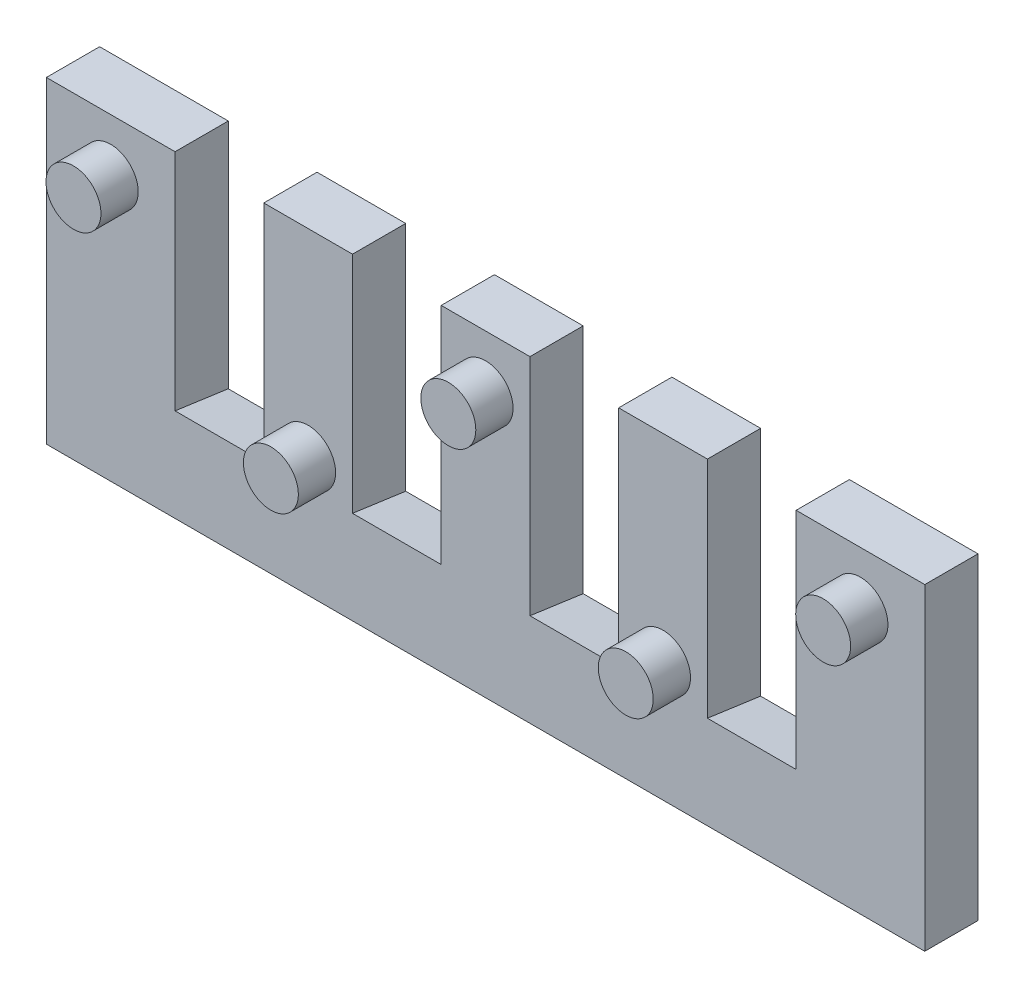
ISO-10303-21;
HEADER;
FILE_DESCRIPTION(('STEP AP214'),'2;1');
FILE_NAME('part.step','',(''),(''),'','','');
FILE_SCHEMA(('AUTOMOTIVE_DESIGN { 1 0 10303 214 1 1 1 1 }'));
ENDSEC;
DATA;
#1=APPLICATION_CONTEXT('core data for automotive mechanical design processes');
#2=APPLICATION_PROTOCOL_DEFINITION('international standard','automotive_design',2000,#1);
#3=PRODUCT_CONTEXT('',#1,'mechanical');
#4=PRODUCT('Part','Part','',(#3));
#5=PRODUCT_RELATED_PRODUCT_CATEGORY('part','',(#4));
#6=PRODUCT_DEFINITION_FORMATION('','',#4);
#7=PRODUCT_DEFINITION_CONTEXT('part definition',#1,'design');
#8=PRODUCT_DEFINITION('design','',#6,#7);
#9=PRODUCT_DEFINITION_SHAPE('','',#8);
#10=(LENGTH_UNIT() NAMED_UNIT(*) SI_UNIT(.MILLI.,.METRE.));
#11=(NAMED_UNIT(*) PLANE_ANGLE_UNIT() SI_UNIT($,.RADIAN.));
#12=(NAMED_UNIT(*) SI_UNIT($,.STERADIAN.) SOLID_ANGLE_UNIT());
#13=UNCERTAINTY_MEASURE_WITH_UNIT(LENGTH_MEASURE(1.E-05),#10,'distance_accuracy_value','');
#14=(GEOMETRIC_REPRESENTATION_CONTEXT(3) GLOBAL_UNCERTAINTY_ASSIGNED_CONTEXT((#13)) GLOBAL_UNIT_ASSIGNED_CONTEXT((#10,
#11,#12)) REPRESENTATION_CONTEXT('',''));
#15=CARTESIAN_POINT('',(0.,0.,0.));
#16=DIRECTION('',(0.,0.,1.));
#17=DIRECTION('',(1.,0.,0.));
#18=AXIS2_PLACEMENT_3D('',#15,#16,#17);
#19=CARTESIAN_POINT('',(0.,0.,0.));
#20=DIRECTION('',(0.,0.99026806874157,-0.139173100960066));
#21=DIRECTION('',(0.,0.139173100960066,0.99026806874157));
#22=AXIS2_PLACEMENT_3D('',#19,#20,#21);
#23=PLANE('',#22);
#24=DIRECTION('',(-1.,0.,0.));
#25=VECTOR('',#24,1.);
#26=CARTESIAN_POINT('',(0.,-16.864900164287,-120.));
#27=LINE('',#26,#25);
#28=CARTESIAN_POINT('',(23.3333333333333,-16.864900164287,-120.));
#29=VERTEX_POINT('',#28);
#30=CARTESIAN_POINT('',(16.6666666666667,-16.864900164287,-120.));
#31=VERTEX_POINT('',#30);
#32=EDGE_CURVE('E301',#29,#31,#27,.T.);
#33=ORIENTED_EDGE('',*,*,#32,.F.);
#34=DIRECTION('',(0.,0.139173100960066,0.99026806874157));
#35=VECTOR('',#34,1.);
#36=CARTESIAN_POINT('',(23.3333333333333,0.,0.));
#37=LINE('',#36,#35);
#38=CARTESIAN_POINT('',(23.3333333333333,-17.4270635030966,-124.));
#39=VERTEX_POINT('',#38);
#40=EDGE_CURVE('E244',#39,#29,#37,.T.);
#41=ORIENTED_EDGE('',*,*,#40,.F.);
#42=DIRECTION('',(1.,0.,0.));
#43=VECTOR('',#42,1.);
#44=CARTESIAN_POINT('',(33.,-17.4270635030966,-124.));
#45=LINE('',#44,#43);
#46=CARTESIAN_POINT('',(16.6666666666667,-17.4270635030966,-124.));
#47=VERTEX_POINT('',#46);
#48=EDGE_CURVE('E263',#47,#39,#45,.T.);
#49=ORIENTED_EDGE('',*,*,#48,.F.);
#50=DIRECTION('',(0.,-0.139173100960066,-0.99026806874157));
#51=VECTOR('',#50,1.);
#52=CARTESIAN_POINT('',(16.6666666666667,-17.5517589401369,-124.887254137236));
#53=LINE('',#52,#51);
#54=EDGE_CURVE('E242',#31,#47,#53,.T.);
#55=ORIENTED_EDGE('',*,*,#54,.F.);
#56=EDGE_LOOP('',(#33,#41,#49,#55));
#57=FACE_BOUND('',#56,.T.);
#58=ADVANCED_FACE('F39',(#57),#23,.T.);
#59=CARTESIAN_POINT('',(16.6666666666667,19.1503740799003,-130.04540254723));
#60=DIRECTION('',(-1.,0.,0.));
#61=DIRECTION('',(0.,0.,1.));
#62=AXIS2_PLACEMENT_3D('',#59,#60,#61);
#63=PLANE('',#62);
#64=DIRECTION('',(0.,0.,1.));
#65=VECTOR('',#64,1.);
#66=CARTESIAN_POINT('',(16.6666666666667,0.,0.));
#67=LINE('',#66,#65);
#68=CARTESIAN_POINT('',(16.6666666666667,0.,-124.));
#69=VERTEX_POINT('',#68);
#70=CARTESIAN_POINT('',(16.6666666666667,0.,-120.));
#71=VERTEX_POINT('',#70);
#72=EDGE_CURVE('E266',#69,#71,#67,.T.);
#73=ORIENTED_EDGE('',*,*,#72,.T.);
#74=DIRECTION('',(0.,-1.,0.));
#75=VECTOR('',#74,1.);
#76=CARTESIAN_POINT('',(16.6666666666667,19.1503740799003,-120.));
#77=LINE('',#76,#75);
#78=EDGE_CURVE('E320',#71,#31,#77,.T.);
#79=ORIENTED_EDGE('',*,*,#78,.T.);
#80=ORIENTED_EDGE('',*,*,#54,.T.);
#81=DIRECTION('',(0.,1.,0.));
#82=VECTOR('',#81,1.);
#83=CARTESIAN_POINT('',(16.6666666666667,0.,-124.));
#84=LINE('',#83,#82);
#85=EDGE_CURVE('E269',#47,#69,#84,.T.);
#86=ORIENTED_EDGE('',*,*,#85,.T.);
#87=EDGE_LOOP('',(#73,#79,#80,#86));
#88=FACE_BOUND('',#87,.T.);
#89=ADVANCED_FACE('F396',(#88),#63,.F.);
#90=CARTESIAN_POINT('',(33.,0.,0.));
#91=DIRECTION('',(0.,1.,0.));
#92=DIRECTION('',(0.,0.,1.));
#93=AXIS2_PLACEMENT_3D('',#90,#91,#92);
#94=PLANE('',#93);
#95=DIRECTION('',(-1.,0.,0.));
#96=VECTOR('',#95,1.);
#97=CARTESIAN_POINT('',(33.,0.,-120.));
#98=LINE('',#97,#96);
#99=CARTESIAN_POINT('',(10.,0.,-120.));
#100=VERTEX_POINT('',#99);
#101=EDGE_CURVE('E306',#71,#100,#98,.T.);
#102=ORIENTED_EDGE('',*,*,#101,.F.);
#103=ORIENTED_EDGE('',*,*,#72,.F.);
#104=DIRECTION('',(-1.,0.,0.));
#105=VECTOR('',#104,1.);
#106=CARTESIAN_POINT('',(33.,0.,-124.));
#107=LINE('',#106,#105);
#108=CARTESIAN_POINT('',(10.,0.,-124.));
#109=VERTEX_POINT('',#108);
#110=EDGE_CURVE('E290',#69,#109,#107,.T.);
#111=ORIENTED_EDGE('',*,*,#110,.T.);
#112=DIRECTION('',(0.,0.,-1.));
#113=VECTOR('',#112,1.);
#114=CARTESIAN_POINT('',(10.,0.,0.));
#115=LINE('',#114,#113);
#116=EDGE_CURVE('E259',#100,#109,#115,.T.);
#117=ORIENTED_EDGE('',*,*,#116,.F.);
#118=EDGE_LOOP('',(#102,#103,#111,#117));
#119=FACE_BOUND('',#118,.T.);
#120=ADVANCED_FACE('F400',(#119),#94,.T.);
#121=CARTESIAN_POINT('',(10.,36.7021330200372,-5.15814840999424));
#122=DIRECTION('',(1.,0.,0.));
#123=DIRECTION('',(0.,0.,-1.));
#124=AXIS2_PLACEMENT_3D('',#121,#122,#123);
#125=PLANE('',#124);
#126=DIRECTION('',(0.,0.139173100960066,0.99026806874157));
#127=VECTOR('',#126,1.);
#128=CARTESIAN_POINT('',(10.,0.,0.));
#129=LINE('',#128,#127);
#130=CARTESIAN_POINT('',(10.,-17.4270635030966,-124.));
#131=VERTEX_POINT('',#130);
#132=CARTESIAN_POINT('',(10.,-16.864900164287,-120.));
#133=VERTEX_POINT('',#132);
#134=EDGE_CURVE('E245',#131,#133,#129,.T.);
#135=ORIENTED_EDGE('',*,*,#134,.T.);
#136=DIRECTION('',(0.,1.,0.));
#137=VECTOR('',#136,1.);
#138=CARTESIAN_POINT('',(10.,36.7021330200373,-120.));
#139=LINE('',#138,#137);
#140=EDGE_CURVE('E312',#133,#100,#139,.T.);
#141=ORIENTED_EDGE('',*,*,#140,.T.);
#142=ORIENTED_EDGE('',*,*,#116,.T.);
#143=DIRECTION('',(0.,-1.,0.));
#144=VECTOR('',#143,1.);
#145=CARTESIAN_POINT('',(10.,0.,-124.));
#146=LINE('',#145,#144);
#147=EDGE_CURVE('E261',#109,#131,#146,.T.);
#148=ORIENTED_EDGE('',*,*,#147,.T.);
#149=EDGE_LOOP('',(#135,#141,#142,#148));
#150=FACE_BOUND('',#149,.T.);
#151=ADVANCED_FACE('F416',(#150),#125,.F.);
#152=CARTESIAN_POINT('',(0.,0.,0.));
#153=DIRECTION('',(0.,0.99026806874157,-0.139173100960066));
#154=DIRECTION('',(0.,0.139173100960066,0.99026806874157));
#155=AXIS2_PLACEMENT_3D('',#152,#153,#154);
#156=PLANE('',#155);
#157=DIRECTION('',(-1.,0.,0.));
#158=VECTOR('',#157,1.);
#159=CARTESIAN_POINT('',(0.,-16.864900164287,-120.));
#160=LINE('',#159,#158);
#161=CARTESIAN_POINT('',(3.33333333333333,-16.864900164287,-120.));
#162=VERTEX_POINT('',#161);
#163=EDGE_CURVE('E305',#133,#162,#160,.T.);
#164=ORIENTED_EDGE('',*,*,#163,.F.);
#165=ORIENTED_EDGE('',*,*,#134,.F.);
#166=DIRECTION('',(1.,0.,0.));
#167=VECTOR('',#166,1.);
#168=CARTESIAN_POINT('',(33.,-17.4270635030966,-124.));
#169=LINE('',#168,#167);
#170=CARTESIAN_POINT('',(3.33333333333333,-17.4270635030966,-124.));
#171=VERTEX_POINT('',#170);
#172=EDGE_CURVE('E248',#171,#131,#169,.T.);
#173=ORIENTED_EDGE('',*,*,#172,.F.);
#174=DIRECTION('',(0.,-0.139173100960066,-0.99026806874157));
#175=VECTOR('',#174,1.);
#176=CARTESIAN_POINT('',(3.33333333333333,-17.5517589401369,-124.887254137236));
#177=LINE('',#176,#175);
#178=EDGE_CURVE('E241',#162,#171,#177,.T.);
#179=ORIENTED_EDGE('',*,*,#178,.F.);
#180=EDGE_LOOP('',(#164,#165,#173,#179));
#181=FACE_BOUND('',#180,.T.);
#182=ADVANCED_FACE('F414',(#181),#156,.T.);
#183=CARTESIAN_POINT('',(3.33333333333333,19.1503740799003,-130.04540254723));
#184=DIRECTION('',(-1.,0.,0.));
#185=DIRECTION('',(0.,0.,1.));
#186=AXIS2_PLACEMENT_3D('',#183,#184,#185);
#187=PLANE('',#186);
#188=DIRECTION('',(0.,0.,1.));
#189=VECTOR('',#188,1.);
#190=CARTESIAN_POINT('',(3.33333333333332,0.,0.));
#191=LINE('',#190,#189);
#192=CARTESIAN_POINT('',(3.33333333333333,0.,-124.));
#193=VERTEX_POINT('',#192);
#194=CARTESIAN_POINT('',(3.33333333333333,0.,-120.));
#195=VERTEX_POINT('',#194);
#196=EDGE_CURVE('E254',#193,#195,#191,.T.);
#197=ORIENTED_EDGE('',*,*,#196,.T.);
#198=DIRECTION('',(0.,-1.,0.));
#199=VECTOR('',#198,1.);
#200=CARTESIAN_POINT('',(3.33333333333333,19.1503740799003,-120.));
#201=LINE('',#200,#199);
#202=EDGE_CURVE('E326',#195,#162,#201,.T.);
#203=ORIENTED_EDGE('',*,*,#202,.T.);
#204=ORIENTED_EDGE('',*,*,#178,.T.);
#205=DIRECTION('',(0.,1.,0.));
#206=VECTOR('',#205,1.);
#207=CARTESIAN_POINT('',(3.33333333333333,0.,-124.));
#208=LINE('',#207,#206);
#209=EDGE_CURVE('E257',#171,#193,#208,.T.);
#210=ORIENTED_EDGE('',*,*,#209,.T.);
#211=EDGE_LOOP('',(#197,#203,#204,#210));
#212=FACE_BOUND('',#211,.T.);
#213=ADVANCED_FACE('F408',(#212),#187,.F.);
#214=DIRECTION('',(-1.,0.,0.));
#215=VECTOR('',#214,1.);
#216=CARTESIAN_POINT('',(33.,0.,-120.));
#217=LINE('',#216,#215);
#218=CARTESIAN_POINT('',(33.,0.,-120.));
#219=VERTEX_POINT('',#218);
#220=CARTESIAN_POINT('',(23.3333333333333,0.,-120.));
#221=VERTEX_POINT('',#220);
#222=EDGE_CURVE('E309',#219,#221,#217,.T.);
#223=ORIENTED_EDGE('',*,*,#222,.F.);
#224=DIRECTION('',(0.,0.,-1.));
#225=VECTOR('',#224,1.);
#226=CARTESIAN_POINT('',(33.,0.,0.));
#227=LINE('',#226,#225);
#228=CARTESIAN_POINT('',(33.,0.,-124.));
#229=VERTEX_POINT('',#228);
#230=EDGE_CURVE('E283',#219,#229,#227,.T.);
#231=ORIENTED_EDGE('',*,*,#230,.T.);
#232=CARTESIAN_POINT('',(23.3333333333333,0.,-124.));
#233=VERTEX_POINT('',#232);
#234=EDGE_CURVE('E286',#229,#233,#107,.T.);
#235=ORIENTED_EDGE('',*,*,#234,.T.);
#236=DIRECTION('',(0.,0.,-1.));
#237=VECTOR('',#236,1.);
#238=CARTESIAN_POINT('',(23.3333333333333,0.,0.));
#239=LINE('',#238,#237);
#240=EDGE_CURVE('E271',#221,#233,#239,.T.);
#241=ORIENTED_EDGE('',*,*,#240,.F.);
#242=EDGE_LOOP('',(#223,#231,#235,#241));
#243=FACE_BOUND('',#242,.T.);
#244=ADVANCED_FACE('F380',(#243),#94,.T.);
#245=CARTESIAN_POINT('',(23.3333333333333,36.7021330200372,-5.15814840999424));
#246=DIRECTION('',(1.,0.,0.));
#247=DIRECTION('',(0.,0.,-1.));
#248=AXIS2_PLACEMENT_3D('',#245,#246,#247);
#249=PLANE('',#248);
#250=ORIENTED_EDGE('',*,*,#40,.T.);
#251=DIRECTION('',(0.,1.,0.));
#252=VECTOR('',#251,1.);
#253=CARTESIAN_POINT('',(23.3333333333333,36.7021330200373,-120.));
#254=LINE('',#253,#252);
#255=EDGE_CURVE('E324',#29,#221,#254,.T.);
#256=ORIENTED_EDGE('',*,*,#255,.T.);
#257=ORIENTED_EDGE('',*,*,#240,.T.);
#258=DIRECTION('',(0.,-1.,0.));
#259=VECTOR('',#258,1.);
#260=CARTESIAN_POINT('',(23.3333333333333,0.,-124.));
#261=LINE('',#260,#259);
#262=EDGE_CURVE('E273',#233,#39,#261,.T.);
#263=ORIENTED_EDGE('',*,*,#262,.T.);
#264=EDGE_LOOP('',(#250,#256,#257,#263));
#265=FACE_BOUND('',#264,.T.);
#266=ADVANCED_FACE('F389',(#265),#249,.F.);
#267=DIRECTION('',(-1.,0.,0.));
#268=VECTOR('',#267,1.);
#269=CARTESIAN_POINT('',(33.,0.,-120.));
#270=LINE('',#269,#268);
#271=CARTESIAN_POINT('',(-3.33333333333333,0.,-120.));
#272=VERTEX_POINT('',#271);
#273=EDGE_CURVE('E302',#195,#272,#270,.T.);
#274=ORIENTED_EDGE('',*,*,#273,.F.);
#275=ORIENTED_EDGE('',*,*,#196,.F.);
#276=CARTESIAN_POINT('',(-3.33333333333333,0.,-124.));
#277=VERTEX_POINT('',#276);
#278=EDGE_CURVE('E285',#193,#277,#107,.T.);
#279=ORIENTED_EDGE('',*,*,#278,.T.);
#280=DIRECTION('',(0.,0.,1.));
#281=VECTOR('',#280,1.);
#282=CARTESIAN_POINT('',(-3.33333333333332,0.,0.));
#283=LINE('',#282,#281);
#284=EDGE_CURVE('E195',#277,#272,#283,.T.);
#285=ORIENTED_EDGE('',*,*,#284,.T.);
#286=EDGE_LOOP('',(#274,#275,#279,#285));
#287=FACE_BOUND('',#286,.T.);
#288=ADVANCED_FACE('F404',(#287),#94,.T.);
#289=CARTESIAN_POINT('',(-10.,36.7021330200372,-5.15814840999424));
#290=DIRECTION('',(-1.,0.,0.));
#291=DIRECTION('',(0.,0.,-1.));
#292=AXIS2_PLACEMENT_3D('',#289,#290,#291);
#293=PLANE('',#292);
#294=DIRECTION('',(0.,0.,-1.));
#295=VECTOR('',#294,1.);
#296=CARTESIAN_POINT('',(-10.,0.,0.));
#297=LINE('',#296,#295);
#298=CARTESIAN_POINT('',(-10.,0.,-120.));
#299=VERTEX_POINT('',#298);
#300=CARTESIAN_POINT('',(-10.,0.,-124.));
#301=VERTEX_POINT('',#300);
#302=EDGE_CURVE('E198',#299,#301,#297,.T.);
#303=ORIENTED_EDGE('',*,*,#302,.F.);
#304=DIRECTION('',(0.,-1.,0.));
#305=VECTOR('',#304,1.);
#306=CARTESIAN_POINT('',(-10.,36.7021330200373,-120.));
#307=LINE('',#306,#305);
#308=CARTESIAN_POINT('',(-10.,-16.864900164287,-120.));
#309=VERTEX_POINT('',#308);
#310=EDGE_CURVE('E318',#299,#309,#307,.T.);
#311=ORIENTED_EDGE('',*,*,#310,.T.);
#312=DIRECTION('',(0.,0.139173100960066,0.99026806874157));
#313=VECTOR('',#312,1.);
#314=CARTESIAN_POINT('',(-10.,0.,0.));
#315=LINE('',#314,#313);
#316=CARTESIAN_POINT('',(-10.,-17.4270635030966,-124.));
#317=VERTEX_POINT('',#316);
#318=EDGE_CURVE('E187',#317,#309,#315,.T.);
#319=ORIENTED_EDGE('',*,*,#318,.F.);
#320=DIRECTION('',(0.,-1.,0.));
#321=VECTOR('',#320,1.);
#322=CARTESIAN_POINT('',(-10.,0.,-124.));
#323=LINE('',#322,#321);
#324=EDGE_CURVE('E204',#301,#317,#323,.T.);
#325=ORIENTED_EDGE('',*,*,#324,.F.);
#326=EDGE_LOOP('',(#303,#311,#319,#325));
#327=FACE_BOUND('',#326,.T.);
#328=ADVANCED_FACE('F437',(#327),#293,.F.);
#329=CARTESIAN_POINT('',(-33.,0.,0.));
#330=DIRECTION('',(0.,1.,0.));
#331=DIRECTION('',(0.,0.,1.));
#332=AXIS2_PLACEMENT_3D('',#329,#330,#331);
#333=PLANE('',#332);
#334=DIRECTION('',(-1.,0.,0.));
#335=VECTOR('',#334,1.);
#336=CARTESIAN_POINT('',(-33.,0.,-120.));
#337=LINE('',#336,#335);
#338=CARTESIAN_POINT('',(-23.3333333333333,0.,-120.));
#339=VERTEX_POINT('',#338);
#340=CARTESIAN_POINT('',(-33.,0.,-120.));
#341=VERTEX_POINT('',#340);
#342=EDGE_CURVE('E298',#339,#341,#337,.T.);
#343=ORIENTED_EDGE('',*,*,#342,.F.);
#344=DIRECTION('',(0.,0.,-1.));
#345=VECTOR('',#344,1.);
#346=CARTESIAN_POINT('',(-23.3333333333333,0.,0.));
#347=LINE('',#346,#345);
#348=CARTESIAN_POINT('',(-23.3333333333333,0.,-124.));
#349=VERTEX_POINT('',#348);
#350=EDGE_CURVE('E222',#339,#349,#347,.T.);
#351=ORIENTED_EDGE('',*,*,#350,.T.);
#352=DIRECTION('',(1.,0.,0.));
#353=VECTOR('',#352,1.);
#354=CARTESIAN_POINT('',(-33.,0.,-124.));
#355=LINE('',#354,#353);
#356=CARTESIAN_POINT('',(-33.,0.,-124.));
#357=VERTEX_POINT('',#356);
#358=EDGE_CURVE('E238',#357,#349,#355,.T.);
#359=ORIENTED_EDGE('',*,*,#358,.F.);
#360=DIRECTION('',(0.,0.,-1.));
#361=VECTOR('',#360,1.);
#362=CARTESIAN_POINT('',(-33.,0.,0.));
#363=LINE('',#362,#361);
#364=EDGE_CURVE('E235',#341,#357,#363,.T.);
#365=ORIENTED_EDGE('',*,*,#364,.F.);
#366=EDGE_LOOP('',(#343,#351,#359,#365));
#367=FACE_BOUND('',#366,.T.);
#368=ADVANCED_FACE('F433',(#367),#333,.T.);
#369=DIRECTION('',(-1.,0.,0.));
#370=VECTOR('',#369,1.);
#371=CARTESIAN_POINT('',(-33.,0.,-120.));
#372=LINE('',#371,#370);
#373=CARTESIAN_POINT('',(-16.6666666666667,0.,-120.));
#374=VERTEX_POINT('',#373);
#375=EDGE_CURVE('E295',#299,#374,#372,.T.);
#376=ORIENTED_EDGE('',*,*,#375,.F.);
#377=ORIENTED_EDGE('',*,*,#302,.T.);
#378=CARTESIAN_POINT('',(-16.6666666666667,0.,-124.));
#379=VERTEX_POINT('',#378);
#380=EDGE_CURVE('E237',#379,#301,#355,.T.);
#381=ORIENTED_EDGE('',*,*,#380,.F.);
#382=DIRECTION('',(0.,0.,1.));
#383=VECTOR('',#382,1.);
#384=CARTESIAN_POINT('',(-16.6666666666667,0.,0.));
#385=LINE('',#384,#383);
#386=EDGE_CURVE('E217',#379,#374,#385,.T.);
#387=ORIENTED_EDGE('',*,*,#386,.T.);
#388=EDGE_LOOP('',(#376,#377,#381,#387));
#389=FACE_BOUND('',#388,.T.);
#390=ADVANCED_FACE('F436',(#389),#333,.T.);
#391=CARTESIAN_POINT('',(-23.3333333333333,36.7021330200372,-5.15814840999424));
#392=DIRECTION('',(-1.,0.,0.));
#393=DIRECTION('',(0.,0.,-1.));
#394=AXIS2_PLACEMENT_3D('',#391,#392,#393);
#395=PLANE('',#394);
#396=ORIENTED_EDGE('',*,*,#350,.F.);
#397=DIRECTION('',(0.,-1.,0.));
#398=VECTOR('',#397,1.);
#399=CARTESIAN_POINT('',(-23.3333333333333,36.7021330200373,-120.));
#400=LINE('',#399,#398);
#401=CARTESIAN_POINT('',(-23.3333333333333,-16.864900164287,-120.));
#402=VERTEX_POINT('',#401);
#403=EDGE_CURVE('E62',#339,#402,#400,.T.);
#404=ORIENTED_EDGE('',*,*,#403,.T.);
#405=DIRECTION('',(0.,0.139173100960066,0.99026806874157));
#406=VECTOR('',#405,1.);
#407=CARTESIAN_POINT('',(-23.3333333333333,0.,0.));
#408=LINE('',#407,#406);
#409=CARTESIAN_POINT('',(-23.3333333333333,-17.4270635030966,-124.));
#410=VERTEX_POINT('',#409);
#411=EDGE_CURVE('E205',#410,#402,#408,.T.);
#412=ORIENTED_EDGE('',*,*,#411,.F.);
#413=DIRECTION('',(0.,-1.,0.));
#414=VECTOR('',#413,1.);
#415=CARTESIAN_POINT('',(-23.3333333333333,0.,-124.));
#416=LINE('',#415,#414);
#417=EDGE_CURVE('E224',#349,#410,#416,.T.);
#418=ORIENTED_EDGE('',*,*,#417,.F.);
#419=EDGE_LOOP('',(#396,#404,#412,#418));
#420=FACE_BOUND('',#419,.T.);
#421=ADVANCED_FACE('F431',(#420),#395,.F.);
#422=CARTESIAN_POINT('',(33.,0.,-124.));
#423=DIRECTION('',(0.,0.,-1.));
#424=DIRECTION('',(-1.,0.,0.));
#425=AXIS2_PLACEMENT_3D('',#422,#423,#424);
#426=PLANE('',#425);
#427=ORIENTED_EDGE('',*,*,#262,.F.);
#428=ORIENTED_EDGE('',*,*,#234,.F.);
#429=DIRECTION('',(0.,-1.,0.));
#430=VECTOR('',#429,1.);
#431=CARTESIAN_POINT('',(33.,0.,-124.));
#432=LINE('',#431,#430);
#433=CARTESIAN_POINT('',(33.,-23.864900164287,-124.));
#434=VERTEX_POINT('',#433);
#435=EDGE_CURVE('E280',#229,#434,#432,.T.);
#436=ORIENTED_EDGE('',*,*,#435,.T.);
#437=DIRECTION('',(-1.,0.,0.));
#438=VECTOR('',#437,1.);
#439=CARTESIAN_POINT('',(33.,-23.864900164287,-124.));
#440=LINE('',#439,#438);
#441=CARTESIAN_POINT('',(-33.,-23.864900164287,-124.));
#442=VERTEX_POINT('',#441);
#443=EDGE_CURVE('E289',#434,#442,#440,.T.);
#444=ORIENTED_EDGE('',*,*,#443,.T.);
#445=DIRECTION('',(0.,-1.,0.));
#446=VECTOR('',#445,1.);
#447=CARTESIAN_POINT('',(-33.,0.,-124.));
#448=LINE('',#447,#446);
#449=EDGE_CURVE('E232',#357,#442,#448,.T.);
#450=ORIENTED_EDGE('',*,*,#449,.F.);
#451=ORIENTED_EDGE('',*,*,#358,.T.);
#452=ORIENTED_EDGE('',*,*,#417,.T.);
#453=DIRECTION('',(-1.,0.,0.));
#454=VECTOR('',#453,1.);
#455=CARTESIAN_POINT('',(-33.,-17.4270635030966,-124.));
#456=LINE('',#455,#454);
#457=CARTESIAN_POINT('',(-16.6666666666667,-17.4270635030966,-124.));
#458=VERTEX_POINT('',#457);
#459=EDGE_CURVE('E214',#458,#410,#456,.T.);
#460=ORIENTED_EDGE('',*,*,#459,.F.);
#461=DIRECTION('',(0.,1.,0.));
#462=VECTOR('',#461,1.);
#463=CARTESIAN_POINT('',(-16.6666666666667,0.,-124.));
#464=LINE('',#463,#462);
#465=EDGE_CURVE('E220',#458,#379,#464,.T.);
#466=ORIENTED_EDGE('',*,*,#465,.T.);
#467=ORIENTED_EDGE('',*,*,#380,.T.);
#468=ORIENTED_EDGE('',*,*,#324,.T.);
#469=DIRECTION('',(-1.,0.,0.));
#470=VECTOR('',#469,1.);
#471=CARTESIAN_POINT('',(-33.,-17.4270635030966,-124.));
#472=LINE('',#471,#470);
#473=CARTESIAN_POINT('',(-3.33333333333333,-17.4270635030966,-124.));
#474=VERTEX_POINT('',#473);
#475=EDGE_CURVE('E182',#474,#317,#472,.T.);
#476=ORIENTED_EDGE('',*,*,#475,.F.);
#477=DIRECTION('',(0.,1.,0.));
#478=VECTOR('',#477,1.);
#479=CARTESIAN_POINT('',(-3.33333333333333,0.,-124.));
#480=LINE('',#479,#478);
#481=EDGE_CURVE('E192',#474,#277,#480,.T.);
#482=ORIENTED_EDGE('',*,*,#481,.T.);
#483=ORIENTED_EDGE('',*,*,#278,.F.);
#484=ORIENTED_EDGE('',*,*,#209,.F.);
#485=ORIENTED_EDGE('',*,*,#172,.T.);
#486=ORIENTED_EDGE('',*,*,#147,.F.);
#487=ORIENTED_EDGE('',*,*,#110,.F.);
#488=ORIENTED_EDGE('',*,*,#85,.F.);
#489=ORIENTED_EDGE('',*,*,#48,.T.);
#490=EDGE_LOOP('',(#427,#428,#436,#444,#450,#451,#452,#460,#466,#467,#468,#476,#482,#483,#484,
#485,#486,#487,#488,#489));
#491=FACE_BOUND('',#490,.T.);
#492=ADVANCED_FACE('F201',(#491),#426,.T.);
#493=CARTESIAN_POINT('',(-16.6666666666667,19.1503740799003,-130.04540254723));
#494=DIRECTION('',(1.,0.,0.));
#495=DIRECTION('',(0.,0.,1.));
#496=AXIS2_PLACEMENT_3D('',#493,#494,#495);
#497=PLANE('',#496);
#498=DIRECTION('',(0.,-0.139173100960066,-0.99026806874157));
#499=VECTOR('',#498,1.);
#500=CARTESIAN_POINT('',(-16.6666666666667,-17.5517589401369,-124.887254137236));
#501=LINE('',#500,#499);
#502=CARTESIAN_POINT('',(-16.6666666666667,-16.864900164287,-120.));
#503=VERTEX_POINT('',#502);
#504=EDGE_CURVE('E208',#503,#458,#501,.T.);
#505=ORIENTED_EDGE('',*,*,#504,.F.);
#506=DIRECTION('',(0.,1.,0.));
#507=VECTOR('',#506,1.);
#508=CARTESIAN_POINT('',(-16.6666666666667,19.1503740799003,-120.));
#509=LINE('',#508,#507);
#510=EDGE_CURVE('E293',#503,#374,#509,.T.);
#511=ORIENTED_EDGE('',*,*,#510,.T.);
#512=ORIENTED_EDGE('',*,*,#386,.F.);
#513=ORIENTED_EDGE('',*,*,#465,.F.);
#514=EDGE_LOOP('',(#505,#511,#512,#513));
#515=FACE_BOUND('',#514,.T.);
#516=ADVANCED_FACE('F427',(#515),#497,.F.);
#517=CARTESIAN_POINT('',(0.,0.,0.));
#518=DIRECTION('',(0.,0.99026806874157,-0.139173100960066));
#519=DIRECTION('',(0.,0.139173100960066,0.99026806874157));
#520=AXIS2_PLACEMENT_3D('',#517,#518,#519);
#521=PLANE('',#520);
#522=DIRECTION('',(-1.,0.,0.));
#523=VECTOR('',#522,1.);
#524=CARTESIAN_POINT('',(0.,-16.864900164287,-120.));
#525=LINE('',#524,#523);
#526=EDGE_CURVE('E12',#503,#402,#525,.T.);
#527=ORIENTED_EDGE('',*,*,#526,.F.);
#528=ORIENTED_EDGE('',*,*,#504,.T.);
#529=ORIENTED_EDGE('',*,*,#459,.T.);
#530=ORIENTED_EDGE('',*,*,#411,.T.);
#531=EDGE_LOOP('',(#527,#528,#529,#530));
#532=FACE_BOUND('',#531,.T.);
#533=ADVANCED_FACE('F423',(#532),#521,.T.);
#534=CARTESIAN_POINT('',(-3.33333333333333,19.1503740799003,-130.04540254723));
#535=DIRECTION('',(1.,0.,0.));
#536=DIRECTION('',(0.,0.,1.));
#537=AXIS2_PLACEMENT_3D('',#534,#535,#536);
#538=PLANE('',#537);
#539=DIRECTION('',(0.,-0.139173100960066,-0.99026806874157));
#540=VECTOR('',#539,1.);
#541=CARTESIAN_POINT('',(-3.33333333333333,-17.5517589401369,-124.887254137236));
#542=LINE('',#541,#540);
#543=CARTESIAN_POINT('',(-3.33333333333333,-16.864900164287,-120.));
#544=VERTEX_POINT('',#543);
#545=EDGE_CURVE('E177',#544,#474,#542,.T.);
#546=ORIENTED_EDGE('',*,*,#545,.F.);
#547=DIRECTION('',(0.,1.,0.));
#548=VECTOR('',#547,1.);
#549=CARTESIAN_POINT('',(-3.33333333333333,19.1503740799003,-120.));
#550=LINE('',#549,#548);
#551=EDGE_CURVE('E315',#544,#272,#550,.T.);
#552=ORIENTED_EDGE('',*,*,#551,.T.);
#553=ORIENTED_EDGE('',*,*,#284,.F.);
#554=ORIENTED_EDGE('',*,*,#481,.F.);
#555=EDGE_LOOP('',(#546,#552,#553,#554));
#556=FACE_BOUND('',#555,.T.);
#557=ADVANCED_FACE('F193',(#556),#538,.F.);
#558=CARTESIAN_POINT('',(0.,0.,0.));
#559=DIRECTION('',(0.,0.99026806874157,-0.139173100960066));
#560=DIRECTION('',(0.,0.139173100960066,0.99026806874157));
#561=AXIS2_PLACEMENT_3D('',#558,#559,#560);
#562=PLANE('',#561);
#563=DIRECTION('',(-1.,0.,0.));
#564=VECTOR('',#563,1.);
#565=CARTESIAN_POINT('',(0.,-16.864900164287,-120.));
#566=LINE('',#565,#564);
#567=EDGE_CURVE('E48',#544,#309,#566,.T.);
#568=ORIENTED_EDGE('',*,*,#567,.F.);
#569=ORIENTED_EDGE('',*,*,#545,.T.);
#570=ORIENTED_EDGE('',*,*,#475,.T.);
#571=ORIENTED_EDGE('',*,*,#318,.T.);
#572=EDGE_LOOP('',(#568,#569,#570,#571));
#573=FACE_BOUND('',#572,.T.);
#574=ADVANCED_FACE('F179',(#573),#562,.T.);
#575=CARTESIAN_POINT('',(33.,0.,0.));
#576=DIRECTION('',(1.,0.,0.));
#577=DIRECTION('',(0.,0.,-1.));
#578=AXIS2_PLACEMENT_3D('',#575,#576,#577);
#579=PLANE('',#578);
#580=ORIENTED_EDGE('',*,*,#230,.F.);
#581=DIRECTION('',(0.,1.,0.));
#582=VECTOR('',#581,1.);
#583=CARTESIAN_POINT('',(33.,2.37904933848248E-13,-120.));
#584=LINE('',#583,#582);
#585=CARTESIAN_POINT('',(33.,-23.864900164287,-120.));
#586=VERTEX_POINT('',#585);
#587=EDGE_CURVE('E275',#586,#219,#584,.T.);
#588=ORIENTED_EDGE('',*,*,#587,.F.);
#589=DIRECTION('',(0.,0.,1.));
#590=VECTOR('',#589,1.);
#591=CARTESIAN_POINT('',(33.,-23.864900164287,0.));
#592=LINE('',#591,#590);
#593=EDGE_CURVE('E277',#434,#586,#592,.T.);
#594=ORIENTED_EDGE('',*,*,#593,.F.);
#595=ORIENTED_EDGE('',*,*,#435,.F.);
#596=EDGE_LOOP('',(#580,#588,#594,#595));
#597=FACE_BOUND('',#596,.T.);
#598=ADVANCED_FACE('F383',(#597),#579,.T.);
#599=CARTESIAN_POINT('',(33.,-23.864900164287,0.));
#600=DIRECTION('',(0.,-1.,0.));
#601=DIRECTION('',(0.,0.,-1.));
#602=AXIS2_PLACEMENT_3D('',#599,#600,#601);
#603=PLANE('',#602);
#604=DIRECTION('',(-1.,0.,0.));
#605=VECTOR('',#604,1.);
#606=CARTESIAN_POINT('',(33.,-23.864900164287,-120.));
#607=LINE('',#606,#605);
#608=CARTESIAN_POINT('',(-33.,-23.864900164287,-120.));
#609=VERTEX_POINT('',#608);
#610=EDGE_CURVE('E292',#586,#609,#607,.T.);
#611=ORIENTED_EDGE('',*,*,#610,.T.);
#612=DIRECTION('',(0.,0.,1.));
#613=VECTOR('',#612,1.);
#614=CARTESIAN_POINT('',(-33.,-23.864900164287,0.));
#615=LINE('',#614,#613);
#616=EDGE_CURVE('E229',#442,#609,#615,.T.);
#617=ORIENTED_EDGE('',*,*,#616,.F.);
#618=ORIENTED_EDGE('',*,*,#443,.F.);
#619=ORIENTED_EDGE('',*,*,#593,.T.);
#620=EDGE_LOOP('',(#611,#617,#618,#619));
#621=FACE_BOUND('',#620,.T.);
#622=ADVANCED_FACE('F366',(#621),#603,.T.);
#623=CARTESIAN_POINT('',(33.,2.37904933848248E-13,-120.));
#624=DIRECTION('',(0.,0.,1.));
#625=DIRECTION('',(0.,-1.,0.));
#626=AXIS2_PLACEMENT_3D('',#623,#624,#625);
#627=PLANE('',#626);
#628=CARTESIAN_POINT('',(-28.1666666666667,-3.99999999999977,-120.));
#629=DIRECTION('',(0.,0.,1.));
#630=DIRECTION('',(0.,-1.,0.));
#631=AXIS2_PLACEMENT_3D('',#628,#629,#630);
#632=CIRCLE('',#631,2.065);
#633=CARTESIAN_POINT('',(-28.1666666666667,-6.06499999999977,-120.));
#634=VERTEX_POINT('',#633);
#635=EDGE_CURVE('E341',#634,#634,#632,.T.);
#636=ORIENTED_EDGE('',*,*,#635,.F.);
#637=EDGE_LOOP('',(#636));
#638=FACE_BOUND('',#637,.T.);
#639=CARTESIAN_POINT('',(-13.3333333333333,-14.864900164287,-120.));
#640=DIRECTION('',(0.,0.,1.));
#641=DIRECTION('',(0.,-1.,0.));
#642=AXIS2_PLACEMENT_3D('',#639,#640,#641);
#643=CIRCLE('',#642,2.065);
#644=CARTESIAN_POINT('',(-13.3333333333333,-16.929900164287,-120.));
#645=VERTEX_POINT('',#644);
#646=EDGE_CURVE('E340',#645,#645,#643,.T.);
#647=ORIENTED_EDGE('',*,*,#646,.F.);
#648=EDGE_LOOP('',(#647));
#649=FACE_BOUND('',#648,.T.);
#650=CARTESIAN_POINT('',(0.,-3.99999999999977,-120.));
#651=DIRECTION('',(0.,0.,1.));
#652=DIRECTION('',(0.,-1.,0.));
#653=AXIS2_PLACEMENT_3D('',#650,#651,#652);
#654=CIRCLE('',#653,2.065);
#655=CARTESIAN_POINT('',(0.,-6.06499999999977,-120.));
#656=VERTEX_POINT('',#655);
#657=EDGE_CURVE('E347',#656,#656,#654,.T.);
#658=ORIENTED_EDGE('',*,*,#657,.F.);
#659=EDGE_LOOP('',(#658));
#660=FACE_BOUND('',#659,.T.);
#661=CARTESIAN_POINT('',(13.3333333333333,-14.864900164287,-120.));
#662=DIRECTION('',(0.,0.,1.));
#663=DIRECTION('',(0.,-1.,0.));
#664=AXIS2_PLACEMENT_3D('',#661,#662,#663);
#665=CIRCLE('',#664,2.065);
#666=CARTESIAN_POINT('',(13.3333333333333,-16.929900164287,-120.));
#667=VERTEX_POINT('',#666);
#668=EDGE_CURVE('E43',#667,#667,#665,.T.);
#669=ORIENTED_EDGE('',*,*,#668,.F.);
#670=EDGE_LOOP('',(#669));
#671=FACE_BOUND('',#670,.T.);
#672=CARTESIAN_POINT('',(28.1666666666667,-3.99999999999976,-120.));
#673=DIRECTION('',(0.,0.,1.));
#674=DIRECTION('',(0.,-1.,0.));
#675=AXIS2_PLACEMENT_3D('',#672,#673,#674);
#676=CIRCLE('',#675,2.065);
#677=CARTESIAN_POINT('',(28.1666666666667,-6.06499999999977,-120.));
#678=VERTEX_POINT('',#677);
#679=EDGE_CURVE('E333',#678,#678,#676,.T.);
#680=ORIENTED_EDGE('',*,*,#679,.F.);
#681=EDGE_LOOP('',(#680));
#682=FACE_BOUND('',#681,.T.);
#683=ORIENTED_EDGE('',*,*,#587,.T.);
#684=ORIENTED_EDGE('',*,*,#222,.T.);
#685=ORIENTED_EDGE('',*,*,#255,.F.);
#686=ORIENTED_EDGE('',*,*,#32,.T.);
#687=ORIENTED_EDGE('',*,*,#78,.F.);
#688=ORIENTED_EDGE('',*,*,#101,.T.);
#689=ORIENTED_EDGE('',*,*,#140,.F.);
#690=ORIENTED_EDGE('',*,*,#163,.T.);
#691=ORIENTED_EDGE('',*,*,#202,.F.);
#692=ORIENTED_EDGE('',*,*,#273,.T.);
#693=ORIENTED_EDGE('',*,*,#551,.F.);
#694=ORIENTED_EDGE('',*,*,#567,.T.);
#695=ORIENTED_EDGE('',*,*,#310,.F.);
#696=ORIENTED_EDGE('',*,*,#375,.T.);
#697=ORIENTED_EDGE('',*,*,#510,.F.);
#698=ORIENTED_EDGE('',*,*,#526,.T.);
#699=ORIENTED_EDGE('',*,*,#403,.F.);
#700=ORIENTED_EDGE('',*,*,#342,.T.);
#701=DIRECTION('',(0.,1.,0.));
#702=VECTOR('',#701,1.);
#703=CARTESIAN_POINT('',(-33.,2.37904933848248E-13,-120.));
#704=LINE('',#703,#702);
#705=EDGE_CURVE('E227',#609,#341,#704,.T.);
#706=ORIENTED_EDGE('',*,*,#705,.F.);
#707=ORIENTED_EDGE('',*,*,#610,.F.);
#708=EDGE_LOOP('',(#683,#684,#685,#686,#687,#688,#689,#690,#691,#692,#693,#694,#695,#696,#697,
#698,#699,#700,#706,#707));
#709=FACE_BOUND('',#708,.T.);
#710=ADVANCED_FACE('F362',(#638,#649,#660,#671,#682,#709),#627,.T.);
#711=CARTESIAN_POINT('',(-33.,0.,0.));
#712=DIRECTION('',(-1.,0.,0.));
#713=DIRECTION('',(0.,0.,-1.));
#714=AXIS2_PLACEMENT_3D('',#711,#712,#713);
#715=PLANE('',#714);
#716=ORIENTED_EDGE('',*,*,#705,.T.);
#717=ORIENTED_EDGE('',*,*,#364,.T.);
#718=ORIENTED_EDGE('',*,*,#449,.T.);
#719=ORIENTED_EDGE('',*,*,#616,.T.);
#720=EDGE_LOOP('',(#716,#717,#718,#719));
#721=FACE_BOUND('',#720,.T.);
#722=ADVANCED_FACE('F365',(#721),#715,.T.);
#723=CARTESIAN_POINT('',(28.1666666666667,-3.99999999999976,-117.2));
#724=DIRECTION('',(0.,0.,-1.));
#725=DIRECTION('',(-1.,0.,0.));
#726=AXIS2_PLACEMENT_3D('',#723,#724,#725);
#727=CYLINDRICAL_SURFACE('',#726,2.065);
#728=CARTESIAN_POINT('',(28.1666666666667,-3.99999999999976,-117.2));
#729=DIRECTION('',(0.,0.,1.));
#730=DIRECTION('',(1.,0.,0.));
#731=AXIS2_PLACEMENT_3D('',#728,#729,#730);
#732=CIRCLE('',#731,2.065);
#733=CARTESIAN_POINT('',(30.2316666666667,-3.99999999999976,-117.2));
#734=VERTEX_POINT('',#733);
#735=EDGE_CURVE('E188',#734,#734,#732,.T.);
#736=ORIENTED_EDGE('',*,*,#735,.F.);
#737=EDGE_LOOP('',(#736));
#738=FACE_BOUND('',#737,.T.);
#739=ORIENTED_EDGE('',*,*,#679,.T.);
#740=EDGE_LOOP('',(#739));
#741=FACE_BOUND('',#740,.T.);
#742=ADVANCED_FACE('F449',(#738,#741),#727,.T.);
#743=CARTESIAN_POINT('',(0.,0.,-117.2));
#744=DIRECTION('',(0.,0.,1.));
#745=DIRECTION('',(1.,0.,0.));
#746=AXIS2_PLACEMENT_3D('',#743,#744,#745);
#747=PLANE('',#746);
#748=ORIENTED_EDGE('',*,*,#735,.T.);
#749=EDGE_LOOP('',(#748));
#750=FACE_BOUND('',#749,.T.);
#751=ADVANCED_FACE('F455',(#750),#747,.T.);
#752=CARTESIAN_POINT('',(13.3333333333333,-14.864900164287,-117.2));
#753=DIRECTION('',(0.,0.,-1.));
#754=DIRECTION('',(-1.,0.,0.));
#755=AXIS2_PLACEMENT_3D('',#752,#753,#754);
#756=CYLINDRICAL_SURFACE('',#755,2.065);
#757=CARTESIAN_POINT('',(13.3333333333333,-14.864900164287,-117.2));
#758=DIRECTION('',(0.,0.,1.));
#759=DIRECTION('',(1.,0.,0.));
#760=AXIS2_PLACEMENT_3D('',#757,#758,#759);
#761=CIRCLE('',#760,2.065);
#762=CARTESIAN_POINT('',(15.3983333333333,-14.864900164287,-117.2));
#763=VERTEX_POINT('',#762);
#764=EDGE_CURVE('E336',#763,#763,#761,.T.);
#765=ORIENTED_EDGE('',*,*,#764,.F.);
#766=EDGE_LOOP('',(#765));
#767=FACE_BOUND('',#766,.T.);
#768=ORIENTED_EDGE('',*,*,#668,.T.);
#769=EDGE_LOOP('',(#768));
#770=FACE_BOUND('',#769,.T.);
#771=ADVANCED_FACE('F360',(#767,#770),#756,.T.);
#772=CARTESIAN_POINT('',(0.,0.,-117.2));
#773=DIRECTION('',(0.,0.,1.));
#774=DIRECTION('',(1.,0.,0.));
#775=AXIS2_PLACEMENT_3D('',#772,#773,#774);
#776=PLANE('',#775);
#777=ORIENTED_EDGE('',*,*,#764,.T.);
#778=EDGE_LOOP('',(#777));
#779=FACE_BOUND('',#778,.T.);
#780=ADVANCED_FACE('F480',(#779),#776,.T.);
#781=CARTESIAN_POINT('',(0.,-3.99999999999977,-117.2));
#782=DIRECTION('',(0.,0.,-1.));
#783=DIRECTION('',(-1.,0.,0.));
#784=AXIS2_PLACEMENT_3D('',#781,#782,#783);
#785=CYLINDRICAL_SURFACE('',#784,2.065);
#786=CARTESIAN_POINT('',(0.,-3.99999999999977,-117.2));
#787=DIRECTION('',(0.,0.,1.));
#788=DIRECTION('',(1.,0.,0.));
#789=AXIS2_PLACEMENT_3D('',#786,#787,#788);
#790=CIRCLE('',#789,2.065);
#791=CARTESIAN_POINT('',(2.065,-3.99999999999977,-117.2));
#792=VERTEX_POINT('',#791);
#793=EDGE_CURVE('E350',#792,#792,#790,.T.);
#794=ORIENTED_EDGE('',*,*,#793,.F.);
#795=EDGE_LOOP('',(#794));
#796=FACE_BOUND('',#795,.T.);
#797=ORIENTED_EDGE('',*,*,#657,.T.);
#798=EDGE_LOOP('',(#797));
#799=FACE_BOUND('',#798,.T.);
#800=ADVANCED_FACE('F482',(#796,#799),#785,.T.);
#801=CARTESIAN_POINT('',(0.,0.,-117.2));
#802=DIRECTION('',(0.,0.,1.));
#803=DIRECTION('',(1.,0.,0.));
#804=AXIS2_PLACEMENT_3D('',#801,#802,#803);
#805=PLANE('',#804);
#806=ORIENTED_EDGE('',*,*,#793,.T.);
#807=EDGE_LOOP('',(#806));
#808=FACE_BOUND('',#807,.T.);
#809=ADVANCED_FACE('F484',(#808),#805,.T.);
#810=CARTESIAN_POINT('',(-13.3333333333333,-14.864900164287,-117.2));
#811=DIRECTION('',(0.,0.,-1.));
#812=DIRECTION('',(-1.,0.,0.));
#813=AXIS2_PLACEMENT_3D('',#810,#811,#812);
#814=CYLINDRICAL_SURFACE('',#813,2.065);
#815=CARTESIAN_POINT('',(-13.3333333333333,-14.864900164287,-117.2));
#816=DIRECTION('',(0.,0.,1.));
#817=DIRECTION('',(1.,0.,0.));
#818=AXIS2_PLACEMENT_3D('',#815,#816,#817);
#819=CIRCLE('',#818,2.065);
#820=CARTESIAN_POINT('',(-11.2683333333333,-14.864900164287,-117.2));
#821=VERTEX_POINT('',#820);
#822=EDGE_CURVE('E344',#821,#821,#819,.T.);
#823=ORIENTED_EDGE('',*,*,#822,.F.);
#824=EDGE_LOOP('',(#823));
#825=FACE_BOUND('',#824,.T.);
#826=ORIENTED_EDGE('',*,*,#646,.T.);
#827=EDGE_LOOP('',(#826));
#828=FACE_BOUND('',#827,.T.);
#829=ADVANCED_FACE('F486',(#825,#828),#814,.T.);
#830=CARTESIAN_POINT('',(0.,0.,-117.2));
#831=DIRECTION('',(0.,0.,1.));
#832=DIRECTION('',(1.,0.,0.));
#833=AXIS2_PLACEMENT_3D('',#830,#831,#832);
#834=PLANE('',#833);
#835=ORIENTED_EDGE('',*,*,#822,.T.);
#836=EDGE_LOOP('',(#835));
#837=FACE_BOUND('',#836,.T.);
#838=ADVANCED_FACE('F488',(#837),#834,.T.);
#839=CARTESIAN_POINT('',(-28.1666666666667,-3.99999999999977,-117.2));
#840=DIRECTION('',(0.,0.,-1.));
#841=DIRECTION('',(-1.,0.,0.));
#842=AXIS2_PLACEMENT_3D('',#839,#840,#841);
#843=CYLINDRICAL_SURFACE('',#842,2.065);
#844=CARTESIAN_POINT('',(-28.1666666666667,-3.99999999999977,-117.2));
#845=DIRECTION('',(0.,0.,1.));
#846=DIRECTION('',(1.,0.,0.));
#847=AXIS2_PLACEMENT_3D('',#844,#845,#846);
#848=CIRCLE('',#847,2.065);
#849=CARTESIAN_POINT('',(-26.1016666666667,-3.99999999999977,-117.2));
#850=VERTEX_POINT('',#849);
#851=EDGE_CURVE('E337',#850,#850,#848,.T.);
#852=ORIENTED_EDGE('',*,*,#851,.F.);
#853=EDGE_LOOP('',(#852));
#854=FACE_BOUND('',#853,.T.);
#855=ORIENTED_EDGE('',*,*,#635,.T.);
#856=EDGE_LOOP('',(#855));
#857=FACE_BOUND('',#856,.T.);
#858=ADVANCED_FACE('F41',(#854,#857),#843,.T.);
#859=CARTESIAN_POINT('',(0.,0.,-117.2));
#860=DIRECTION('',(0.,0.,1.));
#861=DIRECTION('',(1.,0.,0.));
#862=AXIS2_PLACEMENT_3D('',#859,#860,#861);
#863=PLANE('',#862);
#864=ORIENTED_EDGE('',*,*,#851,.T.);
#865=EDGE_LOOP('',(#864));
#866=FACE_BOUND('',#865,.T.);
#867=ADVANCED_FACE('F625',(#866),#863,.T.);
#868=CLOSED_SHELL('',(#58,#89,#120,#151,#182,#213,#244,#266,#288,#328,#368,#390,#421,#492,#516,
#533,#557,#574,#598,#622,#710,#722,#742,#751,#771,#780,#800,#809,#829,#838,#858,#867));
#869=MANIFOLD_SOLID_BREP('B2',#868);
#870=ADVANCED_BREP_SHAPE_REPRESENTATION('',(#18,#869),#14);
#871=SHAPE_DEFINITION_REPRESENTATION(#9,#870);
ENDSEC;
END-ISO-10303-21;
